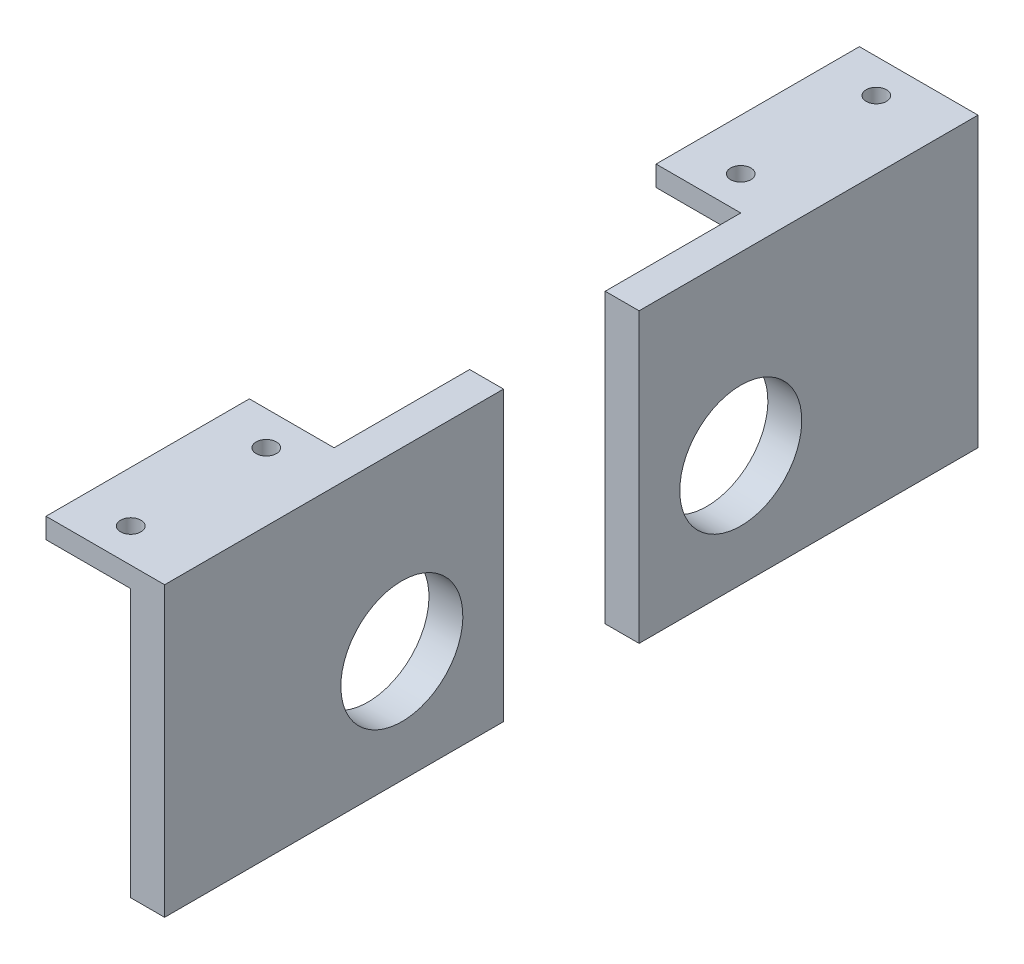
ISO-10303-21;
HEADER;
FILE_DESCRIPTION(('STEP AP214'),'2;1');
FILE_NAME('part.step','',(''),(''),'','','');
FILE_SCHEMA(('AUTOMOTIVE_DESIGN { 1 0 10303 214 1 1 1 1 }'));
ENDSEC;
DATA;
#1=APPLICATION_CONTEXT('core data for automotive mechanical design processes');
#2=APPLICATION_PROTOCOL_DEFINITION('international standard','automotive_design',2000,#1);
#3=PRODUCT_CONTEXT('',#1,'mechanical');
#4=PRODUCT('Part','Part','',(#3));
#5=PRODUCT_RELATED_PRODUCT_CATEGORY('part','',(#4));
#6=PRODUCT_DEFINITION_FORMATION('','',#4);
#7=PRODUCT_DEFINITION_CONTEXT('part definition',#1,'design');
#8=PRODUCT_DEFINITION('design','',#6,#7);
#9=PRODUCT_DEFINITION_SHAPE('','',#8);
#10=(LENGTH_UNIT() NAMED_UNIT(*) SI_UNIT(.MILLI.,.METRE.));
#11=(NAMED_UNIT(*) PLANE_ANGLE_UNIT() SI_UNIT($,.RADIAN.));
#12=(NAMED_UNIT(*) SI_UNIT($,.STERADIAN.) SOLID_ANGLE_UNIT());
#13=UNCERTAINTY_MEASURE_WITH_UNIT(LENGTH_MEASURE(1.E-05),#10,'distance_accuracy_value','');
#14=(GEOMETRIC_REPRESENTATION_CONTEXT(3) GLOBAL_UNCERTAINTY_ASSIGNED_CONTEXT((#13)) GLOBAL_UNIT_ASSIGNED_CONTEXT((#10,
#11,#12)) REPRESENTATION_CONTEXT('',''));
#15=CARTESIAN_POINT('',(0.,0.,0.));
#16=DIRECTION('',(0.,0.,1.));
#17=DIRECTION('',(1.,0.,0.));
#18=AXIS2_PLACEMENT_3D('',#15,#16,#17);
#19=CARTESIAN_POINT('',(5.,-28.5,-105.));
#20=DIRECTION('',(0.,0.,-1.));
#21=DIRECTION('',(1.,0.,0.));
#22=AXIS2_PLACEMENT_3D('',#19,#20,#21);
#23=PLANE('',#22);
#24=DIRECTION('',(0.,1.,0.));
#25=VECTOR('',#24,1.);
#26=CARTESIAN_POINT('',(0.,-28.5,-105.));
#27=LINE('',#26,#25);
#28=CARTESIAN_POINT('',(0.,-28.5,-105.));
#29=VERTEX_POINT('',#28);
#30=CARTESIAN_POINT('',(0.,11.0000000000001,-105.));
#31=VERTEX_POINT('',#30);
#32=EDGE_CURVE('E139',#29,#31,#27,.T.);
#33=ORIENTED_EDGE('',*,*,#32,.T.);
#34=DIRECTION('',(1.,0.,0.));
#35=VECTOR('',#34,1.);
#36=CARTESIAN_POINT('',(5.,11.0000000000001,-105.));
#37=LINE('',#36,#35);
#38=CARTESIAN_POINT('',(-12.5,11.0000000000001,-105.));
#39=VERTEX_POINT('',#38);
#40=EDGE_CURVE('E126',#39,#31,#37,.T.);
#41=ORIENTED_EDGE('',*,*,#40,.F.);
#42=DIRECTION('',(0.,-1.,0.));
#43=VECTOR('',#42,1.);
#44=CARTESIAN_POINT('',(-12.5,14.0000000000001,-105.));
#45=LINE('',#44,#43);
#46=CARTESIAN_POINT('',(-12.5,14.0000000000001,-105.));
#47=VERTEX_POINT('',#46);
#48=EDGE_CURVE('E154',#47,#39,#45,.T.);
#49=ORIENTED_EDGE('',*,*,#48,.F.);
#50=DIRECTION('',(1.,0.,0.));
#51=VECTOR('',#50,1.);
#52=CARTESIAN_POINT('',(5.,14.0000000000001,-105.));
#53=LINE('',#52,#51);
#54=CARTESIAN_POINT('',(5.,14.0000000000001,-105.));
#55=VERTEX_POINT('',#54);
#56=EDGE_CURVE('E152',#47,#55,#53,.T.);
#57=ORIENTED_EDGE('',*,*,#56,.T.);
#58=DIRECTION('',(0.,1.,0.));
#59=VECTOR('',#58,1.);
#60=CARTESIAN_POINT('',(5.,-28.5,-105.));
#61=LINE('',#60,#59);
#62=CARTESIAN_POINT('',(5.,-28.5,-105.));
#63=VERTEX_POINT('',#62);
#64=EDGE_CURVE('E121',#63,#55,#61,.T.);
#65=ORIENTED_EDGE('',*,*,#64,.F.);
#66=DIRECTION('',(-1.,0.,0.));
#67=VECTOR('',#66,1.);
#68=CARTESIAN_POINT('',(5.,-28.5,-105.));
#69=LINE('',#68,#67);
#70=EDGE_CURVE('E12',#63,#29,#69,.T.);
#71=ORIENTED_EDGE('',*,*,#70,.T.);
#72=EDGE_LOOP('',(#33,#41,#49,#57,#65,#71));
#73=FACE_BOUND('',#72,.T.);
#74=ADVANCED_FACE('F51',(#73),#23,.T.);
#75=CARTESIAN_POINT('',(5.,-28.5,-105.));
#76=DIRECTION('',(0.,1.,0.));
#77=DIRECTION('',(0.,0.,-1.));
#78=AXIS2_PLACEMENT_3D('',#75,#76,#77);
#79=PLANE('',#78);
#80=DIRECTION('',(0.,0.,1.));
#81=VECTOR('',#80,1.);
#82=CARTESIAN_POINT('',(0.,-28.5,-105.));
#83=LINE('',#82,#81);
#84=CARTESIAN_POINT('',(0.,-28.5,-55.));
#85=VERTEX_POINT('',#84);
#86=EDGE_CURVE('E135',#29,#85,#83,.T.);
#87=ORIENTED_EDGE('',*,*,#86,.F.);
#88=ORIENTED_EDGE('',*,*,#70,.F.);
#89=DIRECTION('',(0.,0.,1.));
#90=VECTOR('',#89,1.);
#91=CARTESIAN_POINT('',(5.,-28.5,-75.));
#92=LINE('',#91,#90);
#93=CARTESIAN_POINT('',(5.,-28.5,-55.));
#94=VERTEX_POINT('',#93);
#95=EDGE_CURVE('E67',#63,#94,#92,.T.);
#96=ORIENTED_EDGE('',*,*,#95,.T.);
#97=DIRECTION('',(-1.,0.,0.));
#98=VECTOR('',#97,1.);
#99=CARTESIAN_POINT('',(5.,-28.5,-55.));
#100=LINE('',#99,#98);
#101=EDGE_CURVE('E54',#94,#85,#100,.T.);
#102=ORIENTED_EDGE('',*,*,#101,.T.);
#103=EDGE_LOOP('',(#87,#88,#96,#102));
#104=FACE_BOUND('',#103,.T.);
#105=ADVANCED_FACE('F148',(#104),#79,.F.);
#106=CARTESIAN_POINT('',(5.,11.,-55.));
#107=DIRECTION('',(0.,0.,1.));
#108=DIRECTION('',(-1.,0.,0.));
#109=AXIS2_PLACEMENT_3D('',#106,#107,#108);
#110=PLANE('',#109);
#111=DIRECTION('',(0.,-1.,0.));
#112=VECTOR('',#111,1.);
#113=CARTESIAN_POINT('',(0.,11.,-55.));
#114=LINE('',#113,#112);
#115=CARTESIAN_POINT('',(0.,13.9999999999998,-55.));
#116=VERTEX_POINT('',#115);
#117=EDGE_CURVE('E78',#116,#85,#114,.T.);
#118=ORIENTED_EDGE('',*,*,#117,.T.);
#119=ORIENTED_EDGE('',*,*,#101,.F.);
#120=DIRECTION('',(0.,-1.,0.));
#121=VECTOR('',#120,1.);
#122=CARTESIAN_POINT('',(5.,11.,-55.));
#123=LINE('',#122,#121);
#124=CARTESIAN_POINT('',(5.,13.9999999999998,-55.));
#125=VERTEX_POINT('',#124);
#126=EDGE_CURVE('E119',#125,#94,#123,.T.);
#127=ORIENTED_EDGE('',*,*,#126,.F.);
#128=DIRECTION('',(-1.,0.,0.));
#129=VECTOR('',#128,1.);
#130=CARTESIAN_POINT('',(5.,13.9999999999998,-55.));
#131=LINE('',#130,#129);
#132=EDGE_CURVE('E125',#125,#116,#131,.T.);
#133=ORIENTED_EDGE('',*,*,#132,.T.);
#134=EDGE_LOOP('',(#118,#119,#127,#133));
#135=FACE_BOUND('',#134,.T.);
#136=ADVANCED_FACE('F132',(#135),#110,.T.);
#137=CARTESIAN_POINT('',(5.,0.,-90.));
#138=DIRECTION('',(-1.,0.,0.));
#139=DIRECTION('',(0.,0.,-1.));
#140=AXIS2_PLACEMENT_3D('',#137,#138,#139);
#141=PLANE('',#140);
#142=CARTESIAN_POINT('',(5.00000000000007,-12.,-70.));
#143=DIRECTION('',(-1.,0.,0.));
#144=DIRECTION('',(0.,1.,0.));
#145=AXIS2_PLACEMENT_3D('',#142,#143,#144);
#146=CIRCLE('',#145,9.);
#147=CARTESIAN_POINT('',(5.,-2.99999999999997,-70.));
#148=VERTEX_POINT('',#147);
#149=EDGE_CURVE('E173',#148,#148,#146,.T.);
#150=ORIENTED_EDGE('',*,*,#149,.T.);
#151=EDGE_LOOP('',(#150));
#152=FACE_BOUND('',#151,.T.);
#153=ORIENTED_EDGE('',*,*,#64,.T.);
#154=DIRECTION('',(0.,0.,1.));
#155=VECTOR('',#154,1.);
#156=CARTESIAN_POINT('',(5.,13.9999999999999,-75.));
#157=LINE('',#156,#155);
#158=EDGE_CURVE('E115',#55,#125,#157,.T.);
#159=ORIENTED_EDGE('',*,*,#158,.T.);
#160=ORIENTED_EDGE('',*,*,#126,.T.);
#161=ORIENTED_EDGE('',*,*,#95,.F.);
#162=EDGE_LOOP('',(#153,#159,#160,#161));
#163=FACE_BOUND('',#162,.T.);
#164=ADVANCED_FACE('F117',(#152,#163),#141,.F.);
#165=CARTESIAN_POINT('',(0.,0.,-90.));
#166=DIRECTION('',(-1.,0.,0.));
#167=DIRECTION('',(0.,0.,-1.));
#168=AXIS2_PLACEMENT_3D('',#165,#166,#167);
#169=PLANE('',#168);
#170=CARTESIAN_POINT('',(0.,-12.,-70.));
#171=DIRECTION('',(-1.,0.,0.));
#172=DIRECTION('',(0.,1.,0.));
#173=AXIS2_PLACEMENT_3D('',#170,#171,#172);
#174=CIRCLE('',#173,9.);
#175=CARTESIAN_POINT('',(0.,-3.,-70.));
#176=VERTEX_POINT('',#175);
#177=EDGE_CURVE('E142',#176,#176,#174,.T.);
#178=ORIENTED_EDGE('',*,*,#177,.F.);
#179=EDGE_LOOP('',(#178));
#180=FACE_BOUND('',#179,.T.);
#181=ORIENTED_EDGE('',*,*,#32,.F.);
#182=ORIENTED_EDGE('',*,*,#86,.T.);
#183=ORIENTED_EDGE('',*,*,#117,.F.);
#184=DIRECTION('',(0.,0.,-1.));
#185=VECTOR('',#184,1.);
#186=CARTESIAN_POINT('',(0.,13.9999999999998,-55.));
#187=LINE('',#186,#185);
#188=CARTESIAN_POINT('',(0.,13.9999999999999,-75.));
#189=VERTEX_POINT('',#188);
#190=EDGE_CURVE('E130',#116,#189,#187,.T.);
#191=ORIENTED_EDGE('',*,*,#190,.T.);
#192=DIRECTION('',(0.,-1.,0.));
#193=VECTOR('',#192,1.);
#194=CARTESIAN_POINT('',(0.,13.9999999999999,-75.));
#195=LINE('',#194,#193);
#196=CARTESIAN_POINT('',(0.,10.9999999999999,-75.));
#197=VERTEX_POINT('',#196);
#198=EDGE_CURVE('E171',#189,#197,#195,.T.);
#199=ORIENTED_EDGE('',*,*,#198,.T.);
#200=DIRECTION('',(0.,0.,1.));
#201=VECTOR('',#200,1.);
#202=CARTESIAN_POINT('',(0.,11.,-75.));
#203=LINE('',#202,#201);
#204=EDGE_CURVE('E87',#31,#197,#203,.T.);
#205=ORIENTED_EDGE('',*,*,#204,.F.);
#206=EDGE_LOOP('',(#181,#182,#183,#191,#199,#205));
#207=FACE_BOUND('',#206,.T.);
#208=ADVANCED_FACE('F146',(#180,#207),#169,.T.);
#209=CARTESIAN_POINT('',(0.,-12.,-70.));
#210=DIRECTION('',(1.,0.,0.));
#211=DIRECTION('',(0.,1.,0.));
#212=AXIS2_PLACEMENT_3D('',#209,#210,#211);
#213=CYLINDRICAL_SURFACE('',#212,9.);
#214=ORIENTED_EDGE('',*,*,#177,.T.);
#215=EDGE_LOOP('',(#214));
#216=FACE_BOUND('',#215,.T.);
#217=ORIENTED_EDGE('',*,*,#149,.F.);
#218=EDGE_LOOP('',(#217));
#219=FACE_BOUND('',#218,.T.);
#220=ADVANCED_FACE('F179',(#216,#219),#213,.F.);
#221=CARTESIAN_POINT('',(0.,11.,-89.9999999999999));
#222=DIRECTION('',(0.,-1.,0.));
#223=DIRECTION('',(0.,0.,1.));
#224=AXIS2_PLACEMENT_3D('',#221,#222,#223);
#225=PLANE('',#224);
#226=CARTESIAN_POINT('',(-4.99999999999998,10.9999999999999,-80.));
#227=DIRECTION('',(0.,-1.,0.));
#228=DIRECTION('',(0.,0.,-1.));
#229=AXIS2_PLACEMENT_3D('',#226,#227,#228);
#230=CIRCLE('',#229,1.5);
#231=CARTESIAN_POINT('',(-4.99999999999998,10.9999999999999,-81.5));
#232=VERTEX_POINT('',#231);
#233=EDGE_CURVE('E167',#232,#232,#230,.T.);
#234=ORIENTED_EDGE('',*,*,#233,.F.);
#235=EDGE_LOOP('',(#234));
#236=FACE_BOUND('',#235,.T.);
#237=CARTESIAN_POINT('',(-5.00000000000002,11.0000000000001,-100.));
#238=DIRECTION('',(0.,-1.,0.));
#239=DIRECTION('',(0.,0.,-1.));
#240=AXIS2_PLACEMENT_3D('',#237,#238,#239);
#241=CIRCLE('',#240,1.5);
#242=CARTESIAN_POINT('',(-5.00000000000002,11.0000000000002,-101.5));
#243=VERTEX_POINT('',#242);
#244=EDGE_CURVE('E339',#243,#243,#241,.T.);
#245=ORIENTED_EDGE('',*,*,#244,.F.);
#246=EDGE_LOOP('',(#245));
#247=FACE_BOUND('',#246,.T.);
#248=ORIENTED_EDGE('',*,*,#204,.T.);
#249=DIRECTION('',(-1.,0.,0.));
#250=VECTOR('',#249,1.);
#251=CARTESIAN_POINT('',(0.,10.9999999999999,-75.));
#252=LINE('',#251,#250);
#253=CARTESIAN_POINT('',(-12.5,10.9999999999999,-75.));
#254=VERTEX_POINT('',#253);
#255=EDGE_CURVE('E163',#197,#254,#252,.T.);
#256=ORIENTED_EDGE('',*,*,#255,.T.);
#257=DIRECTION('',(0.,0.,-1.));
#258=VECTOR('',#257,1.);
#259=CARTESIAN_POINT('',(-12.5,10.9999999999999,-75.));
#260=LINE('',#259,#258);
#261=EDGE_CURVE('E166',#254,#39,#260,.T.);
#262=ORIENTED_EDGE('',*,*,#261,.T.);
#263=ORIENTED_EDGE('',*,*,#40,.T.);
#264=EDGE_LOOP('',(#248,#256,#262,#263));
#265=FACE_BOUND('',#264,.T.);
#266=ADVANCED_FACE('F181',(#236,#247,#265),#225,.T.);
#267=CARTESIAN_POINT('',(0.,13.9999999999999,-75.));
#268=DIRECTION('',(0.,0.,-1.));
#269=DIRECTION('',(0.,-1.,0.));
#270=AXIS2_PLACEMENT_3D('',#267,#268,#269);
#271=PLANE('',#270);
#272=ORIENTED_EDGE('',*,*,#255,.F.);
#273=ORIENTED_EDGE('',*,*,#198,.F.);
#274=DIRECTION('',(-1.,0.,0.));
#275=VECTOR('',#274,1.);
#276=CARTESIAN_POINT('',(0.,13.9999999999999,-75.));
#277=LINE('',#276,#275);
#278=CARTESIAN_POINT('',(-12.5,13.9999999999999,-75.));
#279=VERTEX_POINT('',#278);
#280=EDGE_CURVE('E159',#189,#279,#277,.T.);
#281=ORIENTED_EDGE('',*,*,#280,.T.);
#282=DIRECTION('',(0.,-1.,0.));
#283=VECTOR('',#282,1.);
#284=CARTESIAN_POINT('',(-12.5,13.9999999999999,-75.));
#285=LINE('',#284,#283);
#286=EDGE_CURVE('E157',#279,#254,#285,.T.);
#287=ORIENTED_EDGE('',*,*,#286,.T.);
#288=EDGE_LOOP('',(#272,#273,#281,#287));
#289=FACE_BOUND('',#288,.T.);
#290=ADVANCED_FACE('F188',(#289),#271,.F.);
#291=CARTESIAN_POINT('',(-12.5,13.9999999999999,-75.));
#292=DIRECTION('',(1.,0.,0.));
#293=DIRECTION('',(0.,0.,1.));
#294=AXIS2_PLACEMENT_3D('',#291,#292,#293);
#295=PLANE('',#294);
#296=ORIENTED_EDGE('',*,*,#261,.F.);
#297=ORIENTED_EDGE('',*,*,#286,.F.);
#298=DIRECTION('',(0.,0.,-1.));
#299=VECTOR('',#298,1.);
#300=CARTESIAN_POINT('',(-12.5,13.9999999999999,-75.));
#301=LINE('',#300,#299);
#302=EDGE_CURVE('E155',#279,#47,#301,.T.);
#303=ORIENTED_EDGE('',*,*,#302,.T.);
#304=ORIENTED_EDGE('',*,*,#48,.T.);
#305=EDGE_LOOP('',(#296,#297,#303,#304));
#306=FACE_BOUND('',#305,.T.);
#307=ADVANCED_FACE('F234',(#306),#295,.F.);
#308=CARTESIAN_POINT('',(0.,14.,-89.9999999999999));
#309=DIRECTION('',(0.,-1.,0.));
#310=DIRECTION('',(0.,0.,1.));
#311=AXIS2_PLACEMENT_3D('',#308,#309,#310);
#312=PLANE('',#311);
#313=CARTESIAN_POINT('',(-4.99999999999998,13.9999999999999,-80.));
#314=DIRECTION('',(0.,-1.,0.));
#315=DIRECTION('',(0.,0.,-1.));
#316=AXIS2_PLACEMENT_3D('',#313,#314,#315);
#317=CIRCLE('',#316,1.5);
#318=CARTESIAN_POINT('',(-4.99999999999998,13.9999999999999,-81.5));
#319=VERTEX_POINT('',#318);
#320=EDGE_CURVE('E334',#319,#319,#317,.T.);
#321=ORIENTED_EDGE('',*,*,#320,.T.);
#322=EDGE_LOOP('',(#321));
#323=FACE_BOUND('',#322,.T.);
#324=CARTESIAN_POINT('',(-5.00000000000002,14.0000000000001,-100.));
#325=DIRECTION('',(0.,-1.,0.));
#326=DIRECTION('',(0.,0.,-1.));
#327=AXIS2_PLACEMENT_3D('',#324,#325,#326);
#328=CIRCLE('',#327,1.5);
#329=CARTESIAN_POINT('',(-5.00000000000002,14.0000000000002,-101.5));
#330=VERTEX_POINT('',#329);
#331=EDGE_CURVE('E335',#330,#330,#328,.T.);
#332=ORIENTED_EDGE('',*,*,#331,.T.);
#333=EDGE_LOOP('',(#332));
#334=FACE_BOUND('',#333,.T.);
#335=ORIENTED_EDGE('',*,*,#158,.F.);
#336=ORIENTED_EDGE('',*,*,#56,.F.);
#337=ORIENTED_EDGE('',*,*,#302,.F.);
#338=ORIENTED_EDGE('',*,*,#280,.F.);
#339=ORIENTED_EDGE('',*,*,#190,.F.);
#340=ORIENTED_EDGE('',*,*,#132,.F.);
#341=EDGE_LOOP('',(#335,#336,#337,#338,#339,#340));
#342=FACE_BOUND('',#341,.T.);
#343=ADVANCED_FACE('F128',(#323,#334,#342),#312,.F.);
#344=CARTESIAN_POINT('',(-5.00000000000002,11.0000000000001,-100.));
#345=DIRECTION('',(0.,1.,0.));
#346=DIRECTION('',(0.,0.,-1.));
#347=AXIS2_PLACEMENT_3D('',#344,#345,#346);
#348=CYLINDRICAL_SURFACE('',#347,1.5);
#349=ORIENTED_EDGE('',*,*,#244,.T.);
#350=EDGE_LOOP('',(#349));
#351=FACE_BOUND('',#350,.T.);
#352=ORIENTED_EDGE('',*,*,#331,.F.);
#353=EDGE_LOOP('',(#352));
#354=FACE_BOUND('',#353,.T.);
#355=ADVANCED_FACE('F254',(#351,#354),#348,.F.);
#356=CARTESIAN_POINT('',(-4.99999999999998,10.9999999999999,-80.));
#357=DIRECTION('',(0.,1.,0.));
#358=DIRECTION('',(0.,0.,-1.));
#359=AXIS2_PLACEMENT_3D('',#356,#357,#358);
#360=CYLINDRICAL_SURFACE('',#359,1.5);
#361=ORIENTED_EDGE('',*,*,#233,.T.);
#362=EDGE_LOOP('',(#361));
#363=FACE_BOUND('',#362,.T.);
#364=ORIENTED_EDGE('',*,*,#320,.F.);
#365=EDGE_LOOP('',(#364));
#366=FACE_BOUND('',#365,.T.);
#367=ADVANCED_FACE('F265',(#363,#366),#360,.F.);
#368=CLOSED_SHELL('',(#74,#105,#136,#164,#208,#220,#266,#290,#307,#343,#355,#367));
#369=MANIFOLD_SOLID_BREP('B2',#368);
#370=CARTESIAN_POINT('',(5.,-28.5,15.));
#371=DIRECTION('',(0.,0.,1.));
#372=DIRECTION('',(1.,0.,0.));
#373=AXIS2_PLACEMENT_3D('',#370,#371,#372);
#374=PLANE('',#373);
#375=DIRECTION('',(0.,1.,0.));
#376=VECTOR('',#375,1.);
#377=CARTESIAN_POINT('',(0.,-28.5,15.));
#378=LINE('',#377,#376);
#379=CARTESIAN_POINT('',(0.,-28.5,15.));
#380=VERTEX_POINT('',#379);
#381=CARTESIAN_POINT('',(0.,11.0000000000001,15.));
#382=VERTEX_POINT('',#381);
#383=EDGE_CURVE('E470',#380,#382,#378,.T.);
#384=ORIENTED_EDGE('',*,*,#383,.F.);
#385=DIRECTION('',(-1.,0.,0.));
#386=VECTOR('',#385,1.);
#387=CARTESIAN_POINT('',(5.,-28.5,15.));
#388=LINE('',#387,#386);
#389=CARTESIAN_POINT('',(5.,-28.5,15.));
#390=VERTEX_POINT('',#389);
#391=EDGE_CURVE('E49',#390,#380,#388,.T.);
#392=ORIENTED_EDGE('',*,*,#391,.F.);
#393=DIRECTION('',(0.,1.,0.));
#394=VECTOR('',#393,1.);
#395=CARTESIAN_POINT('',(5.,-28.5,15.));
#396=LINE('',#395,#394);
#397=CARTESIAN_POINT('',(5.,14.0000000000001,15.));
#398=VERTEX_POINT('',#397);
#399=EDGE_CURVE('E427',#390,#398,#396,.T.);
#400=ORIENTED_EDGE('',*,*,#399,.T.);
#401=DIRECTION('',(1.,0.,0.));
#402=VECTOR('',#401,1.);
#403=CARTESIAN_POINT('',(5.,14.0000000000001,15.));
#404=LINE('',#403,#402);
#405=CARTESIAN_POINT('',(-12.5,14.0000000000001,15.));
#406=VERTEX_POINT('',#405);
#407=EDGE_CURVE('E436',#406,#398,#404,.T.);
#408=ORIENTED_EDGE('',*,*,#407,.F.);
#409=DIRECTION('',(0.,-1.,0.));
#410=VECTOR('',#409,1.);
#411=CARTESIAN_POINT('',(-12.5,14.0000000000001,15.));
#412=LINE('',#411,#410);
#413=CARTESIAN_POINT('',(-12.5,11.0000000000001,15.));
#414=VERTEX_POINT('',#413);
#415=EDGE_CURVE('E452',#406,#414,#412,.T.);
#416=ORIENTED_EDGE('',*,*,#415,.T.);
#417=DIRECTION('',(1.,0.,0.));
#418=VECTOR('',#417,1.);
#419=CARTESIAN_POINT('',(5.,11.0000000000001,15.));
#420=LINE('',#419,#418);
#421=EDGE_CURVE('E437',#414,#382,#420,.T.);
#422=ORIENTED_EDGE('',*,*,#421,.T.);
#423=EDGE_LOOP('',(#384,#392,#400,#408,#416,#422));
#424=FACE_BOUND('',#423,.T.);
#425=ADVANCED_FACE('F358',(#424),#374,.T.);
#426=CARTESIAN_POINT('',(5.,-28.5,15.));
#427=DIRECTION('',(0.,1.,0.));
#428=DIRECTION('',(0.,0.,1.));
#429=AXIS2_PLACEMENT_3D('',#426,#427,#428);
#430=PLANE('',#429);
#431=DIRECTION('',(0.,0.,-1.));
#432=VECTOR('',#431,1.);
#433=CARTESIAN_POINT('',(0.,-28.5,15.));
#434=LINE('',#433,#432);
#435=CARTESIAN_POINT('',(0.,-28.5,-35.));
#436=VERTEX_POINT('',#435);
#437=EDGE_CURVE('E381',#380,#436,#434,.T.);
#438=ORIENTED_EDGE('',*,*,#437,.T.);
#439=DIRECTION('',(-1.,0.,0.));
#440=VECTOR('',#439,1.);
#441=CARTESIAN_POINT('',(5.,-28.5,-35.));
#442=LINE('',#441,#440);
#443=CARTESIAN_POINT('',(5.,-28.5,-35.));
#444=VERTEX_POINT('',#443);
#445=EDGE_CURVE('E361',#444,#436,#442,.T.);
#446=ORIENTED_EDGE('',*,*,#445,.F.);
#447=DIRECTION('',(0.,0.,-1.));
#448=VECTOR('',#447,1.);
#449=CARTESIAN_POINT('',(5.,-28.5,-15.));
#450=LINE('',#449,#448);
#451=EDGE_CURVE('E373',#390,#444,#450,.T.);
#452=ORIENTED_EDGE('',*,*,#451,.F.);
#453=ORIENTED_EDGE('',*,*,#391,.T.);
#454=EDGE_LOOP('',(#438,#446,#452,#453));
#455=FACE_BOUND('',#454,.T.);
#456=ADVANCED_FACE('F493',(#455),#430,.F.);
#457=CARTESIAN_POINT('',(5.,11.,-35.));
#458=DIRECTION('',(0.,0.,-1.));
#459=DIRECTION('',(-1.,0.,0.));
#460=AXIS2_PLACEMENT_3D('',#457,#458,#459);
#461=PLANE('',#460);
#462=DIRECTION('',(0.,-1.,0.));
#463=VECTOR('',#462,1.);
#464=CARTESIAN_POINT('',(0.,11.,-35.));
#465=LINE('',#464,#463);
#466=CARTESIAN_POINT('',(0.,13.9999999999998,-35.));
#467=VERTEX_POINT('',#466);
#468=EDGE_CURVE('E441',#467,#436,#465,.T.);
#469=ORIENTED_EDGE('',*,*,#468,.F.);
#470=DIRECTION('',(-1.,0.,0.));
#471=VECTOR('',#470,1.);
#472=CARTESIAN_POINT('',(5.,13.9999999999998,-35.));
#473=LINE('',#472,#471);
#474=CARTESIAN_POINT('',(5.,13.9999999999998,-35.));
#475=VERTEX_POINT('',#474);
#476=EDGE_CURVE('E433',#475,#467,#473,.T.);
#477=ORIENTED_EDGE('',*,*,#476,.F.);
#478=DIRECTION('',(0.,-1.,0.));
#479=VECTOR('',#478,1.);
#480=CARTESIAN_POINT('',(5.,11.,-35.));
#481=LINE('',#480,#479);
#482=EDGE_CURVE('E420',#475,#444,#481,.T.);
#483=ORIENTED_EDGE('',*,*,#482,.T.);
#484=ORIENTED_EDGE('',*,*,#445,.T.);
#485=EDGE_LOOP('',(#469,#477,#483,#484));
#486=FACE_BOUND('',#485,.T.);
#487=ADVANCED_FACE('F439',(#486),#461,.T.);
#488=CARTESIAN_POINT('',(5.,0.,0.));
#489=DIRECTION('',(-1.,0.,0.));
#490=DIRECTION('',(0.,0.,1.));
#491=AXIS2_PLACEMENT_3D('',#488,#489,#490);
#492=PLANE('',#491);
#493=CARTESIAN_POINT('',(5.00000000000007,-12.,-20.));
#494=DIRECTION('',(1.,0.,0.));
#495=DIRECTION('',(0.,1.,0.));
#496=AXIS2_PLACEMENT_3D('',#493,#494,#495);
#497=CIRCLE('',#496,9.);
#498=CARTESIAN_POINT('',(5.,-2.99999999999997,-20.));
#499=VERTEX_POINT('',#498);
#500=EDGE_CURVE('E466',#499,#499,#497,.T.);
#501=ORIENTED_EDGE('',*,*,#500,.F.);
#502=EDGE_LOOP('',(#501));
#503=FACE_BOUND('',#502,.T.);
#504=ORIENTED_EDGE('',*,*,#399,.F.);
#505=ORIENTED_EDGE('',*,*,#451,.T.);
#506=ORIENTED_EDGE('',*,*,#482,.F.);
#507=DIRECTION('',(0.,0.,-1.));
#508=VECTOR('',#507,1.);
#509=CARTESIAN_POINT('',(5.,13.9999999999999,-15.));
#510=LINE('',#509,#508);
#511=EDGE_CURVE('E424',#398,#475,#510,.T.);
#512=ORIENTED_EDGE('',*,*,#511,.F.);
#513=EDGE_LOOP('',(#504,#505,#506,#512));
#514=FACE_BOUND('',#513,.T.);
#515=ADVANCED_FACE('F423',(#503,#514),#492,.F.);
#516=CARTESIAN_POINT('',(0.,0.,0.));
#517=DIRECTION('',(-1.,0.,0.));
#518=DIRECTION('',(0.,0.,1.));
#519=AXIS2_PLACEMENT_3D('',#516,#517,#518);
#520=PLANE('',#519);
#521=CARTESIAN_POINT('',(0.,-12.,-20.));
#522=DIRECTION('',(1.,0.,0.));
#523=DIRECTION('',(0.,1.,0.));
#524=AXIS2_PLACEMENT_3D('',#521,#522,#523);
#525=CIRCLE('',#524,9.);
#526=CARTESIAN_POINT('',(0.,-3.,-20.));
#527=VERTEX_POINT('',#526);
#528=EDGE_CURVE('E467',#527,#527,#525,.T.);
#529=ORIENTED_EDGE('',*,*,#528,.T.);
#530=EDGE_LOOP('',(#529));
#531=FACE_BOUND('',#530,.T.);
#532=ORIENTED_EDGE('',*,*,#383,.T.);
#533=DIRECTION('',(0.,0.,-1.));
#534=VECTOR('',#533,1.);
#535=CARTESIAN_POINT('',(0.,11.,-15.));
#536=LINE('',#535,#534);
#537=CARTESIAN_POINT('',(0.,10.9999999999999,-15.));
#538=VERTEX_POINT('',#537);
#539=EDGE_CURVE('E389',#382,#538,#536,.T.);
#540=ORIENTED_EDGE('',*,*,#539,.T.);
#541=DIRECTION('',(0.,-1.,0.));
#542=VECTOR('',#541,1.);
#543=CARTESIAN_POINT('',(0.,13.9999999999999,-15.));
#544=LINE('',#543,#542);
#545=CARTESIAN_POINT('',(0.,13.9999999999999,-15.));
#546=VERTEX_POINT('',#545);
#547=EDGE_CURVE('E464',#546,#538,#544,.T.);
#548=ORIENTED_EDGE('',*,*,#547,.F.);
#549=DIRECTION('',(0.,0.,1.));
#550=VECTOR('',#549,1.);
#551=CARTESIAN_POINT('',(0.,13.9999999999998,-35.));
#552=LINE('',#551,#550);
#553=EDGE_CURVE('E442',#467,#546,#552,.T.);
#554=ORIENTED_EDGE('',*,*,#553,.F.);
#555=ORIENTED_EDGE('',*,*,#468,.T.);
#556=ORIENTED_EDGE('',*,*,#437,.F.);
#557=EDGE_LOOP('',(#532,#540,#548,#554,#555,#556));
#558=FACE_BOUND('',#557,.T.);
#559=ADVANCED_FACE('F480',(#531,#558),#520,.T.);
#560=CARTESIAN_POINT('',(0.,-12.,-20.));
#561=DIRECTION('',(1.,0.,0.));
#562=DIRECTION('',(0.,1.,0.));
#563=AXIS2_PLACEMENT_3D('',#560,#561,#562);
#564=CYLINDRICAL_SURFACE('',#563,9.);
#565=ORIENTED_EDGE('',*,*,#528,.F.);
#566=EDGE_LOOP('',(#565));
#567=FACE_BOUND('',#566,.T.);
#568=ORIENTED_EDGE('',*,*,#500,.T.);
#569=EDGE_LOOP('',(#568));
#570=FACE_BOUND('',#569,.T.);
#571=ADVANCED_FACE('F503',(#567,#570),#564,.F.);
#572=CARTESIAN_POINT('',(0.,11.,0.));
#573=DIRECTION('',(0.,-1.,0.));
#574=DIRECTION('',(0.,0.,-1.));
#575=AXIS2_PLACEMENT_3D('',#572,#573,#574);
#576=PLANE('',#575);
#577=CARTESIAN_POINT('',(-4.99999999999998,10.9999999999999,-9.99999999999998));
#578=DIRECTION('',(0.,1.,0.));
#579=DIRECTION('',(0.,0.,1.));
#580=AXIS2_PLACEMENT_3D('',#577,#578,#579);
#581=CIRCLE('',#580,1.5);
#582=CARTESIAN_POINT('',(-4.99999999999998,10.9999999999999,-8.49999999999998));
#583=VERTEX_POINT('',#582);
#584=EDGE_CURVE('E456',#583,#583,#581,.T.);
#585=ORIENTED_EDGE('',*,*,#584,.T.);
#586=EDGE_LOOP('',(#585));
#587=FACE_BOUND('',#586,.T.);
#588=CARTESIAN_POINT('',(-5.00000000000002,11.0000000000001,10.));
#589=DIRECTION('',(0.,1.,0.));
#590=DIRECTION('',(0.,0.,1.));
#591=AXIS2_PLACEMENT_3D('',#588,#589,#590);
#592=CIRCLE('',#591,1.5);
#593=CARTESIAN_POINT('',(-5.00000000000002,11.0000000000002,11.5));
#594=VERTEX_POINT('',#593);
#595=EDGE_CURVE('E541',#594,#594,#592,.T.);
#596=ORIENTED_EDGE('',*,*,#595,.T.);
#597=EDGE_LOOP('',(#596));
#598=FACE_BOUND('',#597,.T.);
#599=ORIENTED_EDGE('',*,*,#539,.F.);
#600=ORIENTED_EDGE('',*,*,#421,.F.);
#601=DIRECTION('',(0.,0.,1.));
#602=VECTOR('',#601,1.);
#603=CARTESIAN_POINT('',(-12.5,10.9999999999999,-15.));
#604=LINE('',#603,#602);
#605=CARTESIAN_POINT('',(-12.5,10.9999999999999,-15.));
#606=VERTEX_POINT('',#605);
#607=EDGE_CURVE('E455',#606,#414,#604,.T.);
#608=ORIENTED_EDGE('',*,*,#607,.F.);
#609=DIRECTION('',(-1.,0.,0.));
#610=VECTOR('',#609,1.);
#611=CARTESIAN_POINT('',(0.,10.9999999999999,-15.));
#612=LINE('',#611,#610);
#613=EDGE_CURVE('E453',#538,#606,#612,.T.);
#614=ORIENTED_EDGE('',*,*,#613,.F.);
#615=EDGE_LOOP('',(#599,#600,#608,#614));
#616=FACE_BOUND('',#615,.T.);
#617=ADVANCED_FACE('F510',(#587,#598,#616),#576,.T.);
#618=CARTESIAN_POINT('',(0.,13.9999999999999,-15.));
#619=DIRECTION('',(0.,0.,1.));
#620=DIRECTION('',(0.,-1.,0.));
#621=AXIS2_PLACEMENT_3D('',#618,#619,#620);
#622=PLANE('',#621);
#623=ORIENTED_EDGE('',*,*,#613,.T.);
#624=DIRECTION('',(0.,-1.,0.));
#625=VECTOR('',#624,1.);
#626=CARTESIAN_POINT('',(-12.5,13.9999999999999,-15.));
#627=LINE('',#626,#625);
#628=CARTESIAN_POINT('',(-12.5,13.9999999999999,-15.));
#629=VERTEX_POINT('',#628);
#630=EDGE_CURVE('E461',#629,#606,#627,.T.);
#631=ORIENTED_EDGE('',*,*,#630,.F.);
#632=DIRECTION('',(-1.,0.,0.));
#633=VECTOR('',#632,1.);
#634=CARTESIAN_POINT('',(0.,13.9999999999999,-15.));
#635=LINE('',#634,#633);
#636=EDGE_CURVE('E444',#546,#629,#635,.T.);
#637=ORIENTED_EDGE('',*,*,#636,.F.);
#638=ORIENTED_EDGE('',*,*,#547,.T.);
#639=EDGE_LOOP('',(#623,#631,#637,#638));
#640=FACE_BOUND('',#639,.T.);
#641=ADVANCED_FACE('F488',(#640),#622,.F.);
#642=CARTESIAN_POINT('',(-12.5,13.9999999999999,-15.));
#643=DIRECTION('',(1.,0.,0.));
#644=DIRECTION('',(0.,0.,-1.));
#645=AXIS2_PLACEMENT_3D('',#642,#643,#644);
#646=PLANE('',#645);
#647=ORIENTED_EDGE('',*,*,#607,.T.);
#648=ORIENTED_EDGE('',*,*,#415,.F.);
#649=DIRECTION('',(0.,0.,1.));
#650=VECTOR('',#649,1.);
#651=CARTESIAN_POINT('',(-12.5,13.9999999999999,-15.));
#652=LINE('',#651,#650);
#653=EDGE_CURVE('E449',#629,#406,#652,.T.);
#654=ORIENTED_EDGE('',*,*,#653,.F.);
#655=ORIENTED_EDGE('',*,*,#630,.T.);
#656=EDGE_LOOP('',(#647,#648,#654,#655));
#657=FACE_BOUND('',#656,.T.);
#658=ADVANCED_FACE('F491',(#657),#646,.F.);
#659=CARTESIAN_POINT('',(0.,14.,0.));
#660=DIRECTION('',(0.,-1.,0.));
#661=DIRECTION('',(0.,0.,-1.));
#662=AXIS2_PLACEMENT_3D('',#659,#660,#661);
#663=PLANE('',#662);
#664=CARTESIAN_POINT('',(-4.99999999999998,13.9999999999999,-10.));
#665=DIRECTION('',(0.,1.,0.));
#666=DIRECTION('',(0.,0.,1.));
#667=AXIS2_PLACEMENT_3D('',#664,#665,#666);
#668=CIRCLE('',#667,1.5);
#669=CARTESIAN_POINT('',(-4.99999999999998,13.9999999999999,-8.50000000000002));
#670=VERTEX_POINT('',#669);
#671=EDGE_CURVE('E536',#670,#670,#668,.T.);
#672=ORIENTED_EDGE('',*,*,#671,.F.);
#673=EDGE_LOOP('',(#672));
#674=FACE_BOUND('',#673,.T.);
#675=CARTESIAN_POINT('',(-5.00000000000002,14.0000000000001,9.99999999999998));
#676=DIRECTION('',(0.,1.,0.));
#677=DIRECTION('',(0.,0.,1.));
#678=AXIS2_PLACEMENT_3D('',#675,#676,#677);
#679=CIRCLE('',#678,1.5);
#680=CARTESIAN_POINT('',(-5.00000000000002,14.0000000000002,11.5));
#681=VERTEX_POINT('',#680);
#682=EDGE_CURVE('E537',#681,#681,#679,.T.);
#683=ORIENTED_EDGE('',*,*,#682,.F.);
#684=EDGE_LOOP('',(#683));
#685=FACE_BOUND('',#684,.T.);
#686=ORIENTED_EDGE('',*,*,#511,.T.);
#687=ORIENTED_EDGE('',*,*,#476,.T.);
#688=ORIENTED_EDGE('',*,*,#553,.T.);
#689=ORIENTED_EDGE('',*,*,#636,.T.);
#690=ORIENTED_EDGE('',*,*,#653,.T.);
#691=ORIENTED_EDGE('',*,*,#407,.T.);
#692=EDGE_LOOP('',(#686,#687,#688,#689,#690,#691));
#693=FACE_BOUND('',#692,.T.);
#694=ADVANCED_FACE('F432',(#674,#685,#693),#663,.F.);
#695=CARTESIAN_POINT('',(-5.00000000000002,11.0000000000001,10.));
#696=DIRECTION('',(0.,1.,0.));
#697=DIRECTION('',(0.,0.,1.));
#698=AXIS2_PLACEMENT_3D('',#695,#696,#697);
#699=CYLINDRICAL_SURFACE('',#698,1.5);
#700=ORIENTED_EDGE('',*,*,#595,.F.);
#701=EDGE_LOOP('',(#700));
#702=FACE_BOUND('',#701,.T.);
#703=ORIENTED_EDGE('',*,*,#682,.T.);
#704=EDGE_LOOP('',(#703));
#705=FACE_BOUND('',#704,.T.);
#706=ADVANCED_FACE('F521',(#702,#705),#699,.F.);
#707=CARTESIAN_POINT('',(-4.99999999999998,10.9999999999999,-9.99999999999998));
#708=DIRECTION('',(0.,1.,0.));
#709=DIRECTION('',(0.,0.,1.));
#710=AXIS2_PLACEMENT_3D('',#707,#708,#709);
#711=CYLINDRICAL_SURFACE('',#710,1.5);
#712=ORIENTED_EDGE('',*,*,#584,.F.);
#713=EDGE_LOOP('',(#712));
#714=FACE_BOUND('',#713,.T.);
#715=ORIENTED_EDGE('',*,*,#671,.T.);
#716=EDGE_LOOP('',(#715));
#717=FACE_BOUND('',#716,.T.);
#718=ADVANCED_FACE('F525',(#714,#717),#711,.F.);
#719=CLOSED_SHELL('',(#425,#456,#487,#515,#559,#571,#617,#641,#658,#694,#706,#718));
#720=MANIFOLD_SOLID_BREP('B6',#719);
#721=ADVANCED_BREP_SHAPE_REPRESENTATION('',(#18,#369,#720),#14);
#722=SHAPE_DEFINITION_REPRESENTATION(#9,#721);
ENDSEC;
END-ISO-10303-21;
